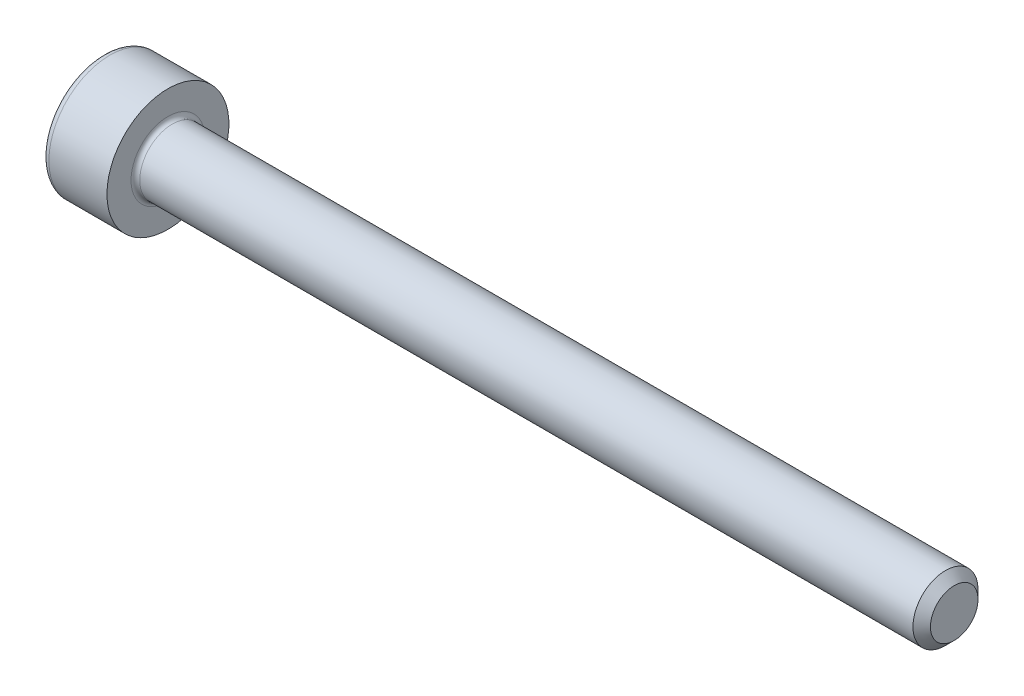
ISO-10303-21;
HEADER;
FILE_DESCRIPTION(('STEP AP214'),'2;1');
FILE_NAME('part.step','',(''),(''),'','','');
FILE_SCHEMA(('AUTOMOTIVE_DESIGN { 1 0 10303 214 1 1 1 1 }'));
ENDSEC;
DATA;
#1=APPLICATION_CONTEXT('core data for automotive mechanical design processes');
#2=APPLICATION_PROTOCOL_DEFINITION('international standard','automotive_design',2000,#1);
#3=PRODUCT_CONTEXT('',#1,'mechanical');
#4=PRODUCT('Part','Part','',(#3));
#5=PRODUCT_RELATED_PRODUCT_CATEGORY('part','',(#4));
#6=PRODUCT_DEFINITION_FORMATION('','',#4);
#7=PRODUCT_DEFINITION_CONTEXT('part definition',#1,'design');
#8=PRODUCT_DEFINITION('design','',#6,#7);
#9=PRODUCT_DEFINITION_SHAPE('','',#8);
#10=(LENGTH_UNIT() NAMED_UNIT(*) SI_UNIT(.MILLI.,.METRE.));
#11=(NAMED_UNIT(*) PLANE_ANGLE_UNIT() SI_UNIT($,.RADIAN.));
#12=(NAMED_UNIT(*) SI_UNIT($,.STERADIAN.) SOLID_ANGLE_UNIT());
#13=UNCERTAINTY_MEASURE_WITH_UNIT(LENGTH_MEASURE(1.E-05),#10,'distance_accuracy_value','');
#14=(GEOMETRIC_REPRESENTATION_CONTEXT(3) GLOBAL_UNCERTAINTY_ASSIGNED_CONTEXT((#13)) GLOBAL_UNIT_ASSIGNED_CONTEXT((#10,
#11,#12)) REPRESENTATION_CONTEXT('',''));
#15=CARTESIAN_POINT('',(0.,0.,0.));
#16=DIRECTION('',(0.,0.,1.));
#17=DIRECTION('',(1.,0.,0.));
#18=AXIS2_PLACEMENT_3D('',#15,#16,#17);
#19=CARTESIAN_POINT('',(0.,0.,0.));
#20=DIRECTION('',(-1.,0.,0.));
#21=DIRECTION('',(0.,0.,1.));
#22=AXIS2_PLACEMENT_3D('',#19,#20,#21);
#23=CYLINDRICAL_SURFACE('',#22,1.39568824458778);
#24=CARTESIAN_POINT('',(0.16,0.,0.));
#25=DIRECTION('',(1.,0.,0.));
#26=DIRECTION('',(0.,0.,-1.));
#27=AXIS2_PLACEMENT_3D('',#24,#25,#26);
#28=CIRCLE('',#27,1.39568824458778);
#29=CARTESIAN_POINT('',(0.16,0.,-1.39568824458778));
#30=VERTEX_POINT('',#29);
#31=EDGE_CURVE('E158',#30,#30,#28,.T.);
#32=ORIENTED_EDGE('',*,*,#31,.T.);
#33=EDGE_LOOP('',(#32));
#34=FACE_BOUND('',#33,.T.);
#35=CARTESIAN_POINT('',(1.48873412756029,0.,0.));
#36=DIRECTION('',(-1.,0.,0.));
#37=DIRECTION('',(0.,0.,1.));
#38=AXIS2_PLACEMENT_3D('',#35,#36,#37);
#39=CIRCLE('',#38,1.39568824458778);
#40=CARTESIAN_POINT('',(1.48873412756029,0.,1.39568824458778));
#41=VERTEX_POINT('',#40);
#42=EDGE_CURVE('E141',#41,#41,#39,.T.);
#43=ORIENTED_EDGE('',*,*,#42,.T.);
#44=EDGE_LOOP('',(#43));
#45=FACE_BOUND('',#44,.T.);
#46=ADVANCED_FACE('F39',(#34,#45),#23,.T.);
#47=CARTESIAN_POINT('',(0.,0.,0.));
#48=DIRECTION('',(1.,0.,0.));
#49=DIRECTION('',(0.,0.,-1.));
#50=AXIS2_PLACEMENT_3D('',#47,#48,#49);
#51=PLANE('',#50);
#52=DIRECTION('',(0.,-0.5,-0.866025403784439));
#53=VECTOR('',#52,1.);
#54=CARTESIAN_POINT('',(0.,0.877572409168232,0.));
#55=LINE('',#54,#53);
#56=CARTESIAN_POINT('',(0.,0.877572409168232,0.));
#57=VERTEX_POINT('',#56);
#58=CARTESIAN_POINT('',(0.,0.438786204584116,-0.760000000000001));
#59=VERTEX_POINT('',#58);
#60=EDGE_CURVE('E128',#57,#59,#55,.T.);
#61=ORIENTED_EDGE('',*,*,#60,.F.);
#62=DIRECTION('',(0.,0.5,-0.866025403784439));
#63=VECTOR('',#62,1.);
#64=CARTESIAN_POINT('',(0.,0.438786204584116,0.76));
#65=LINE('',#64,#63);
#66=CARTESIAN_POINT('',(0.,0.438786204584116,0.76));
#67=VERTEX_POINT('',#66);
#68=EDGE_CURVE('E54',#67,#57,#65,.T.);
#69=ORIENTED_EDGE('',*,*,#68,.F.);
#70=DIRECTION('',(0.,1.,0.));
#71=VECTOR('',#70,1.);
#72=CARTESIAN_POINT('',(0.,-0.438786204584116,0.76));
#73=LINE('',#72,#71);
#74=CARTESIAN_POINT('',(0.,-0.438786204584116,0.76));
#75=VERTEX_POINT('',#74);
#76=EDGE_CURVE('E137',#75,#67,#73,.T.);
#77=ORIENTED_EDGE('',*,*,#76,.F.);
#78=DIRECTION('',(0.,0.5,0.866025403784439));
#79=VECTOR('',#78,1.);
#80=CARTESIAN_POINT('',(0.,-0.877572409168232,0.));
#81=LINE('',#80,#79);
#82=CARTESIAN_POINT('',(0.,-0.877572409168232,0.));
#83=VERTEX_POINT('',#82);
#84=EDGE_CURVE('E135',#83,#75,#81,.T.);
#85=ORIENTED_EDGE('',*,*,#84,.F.);
#86=DIRECTION('',(0.,-0.5,0.866025403784438));
#87=VECTOR('',#86,1.);
#88=CARTESIAN_POINT('',(0.,-0.438786204584116,-0.760000000000001));
#89=LINE('',#88,#87);
#90=CARTESIAN_POINT('',(0.,-0.438786204584116,-0.760000000000001));
#91=VERTEX_POINT('',#90);
#92=EDGE_CURVE('E102',#91,#83,#89,.T.);
#93=ORIENTED_EDGE('',*,*,#92,.F.);
#94=DIRECTION('',(0.,-1.,0.));
#95=VECTOR('',#94,1.);
#96=CARTESIAN_POINT('',(0.,0.438786204584116,-0.760000000000001));
#97=LINE('',#96,#95);
#98=EDGE_CURVE('E131',#59,#91,#97,.T.);
#99=ORIENTED_EDGE('',*,*,#98,.F.);
#100=EDGE_LOOP('',(#61,#69,#77,#85,#93,#99));
#101=FACE_BOUND('',#100,.T.);
#102=CARTESIAN_POINT('',(0.,0.,0.));
#103=DIRECTION('',(1.,0.,0.));
#104=DIRECTION('',(0.,0.,-1.));
#105=AXIS2_PLACEMENT_3D('',#102,#103,#104);
#106=CIRCLE('',#105,1.23568824458778);
#107=CARTESIAN_POINT('',(0.,0.,-1.23568824458778));
#108=VERTEX_POINT('',#107);
#109=EDGE_CURVE('E155',#108,#108,#106,.F.);
#110=ORIENTED_EDGE('',*,*,#109,.T.);
#111=EDGE_LOOP('',(#110));
#112=FACE_BOUND('',#111,.T.);
#113=ADVANCED_FACE('F180',(#101,#112),#51,.F.);
#114=CARTESIAN_POINT('',(19.4887341275603,0.,0.));
#115=DIRECTION('',(-1.,0.,0.));
#116=DIRECTION('',(0.,0.,1.));
#117=AXIS2_PLACEMENT_3D('',#114,#115,#116);
#118=PLANE('',#117);
#119=CARTESIAN_POINT('',(19.4887341275603,0.,0.));
#120=DIRECTION('',(-1.,0.,0.));
#121=DIRECTION('',(0.,0.,1.));
#122=AXIS2_PLACEMENT_3D('',#119,#120,#121);
#123=CIRCLE('',#122,0.544367063780145);
#124=CARTESIAN_POINT('',(19.4887341275603,0.,0.544367063780145));
#125=VERTEX_POINT('',#124);
#126=EDGE_CURVE('E11',#125,#125,#123,.F.);
#127=ORIENTED_EDGE('',*,*,#126,.T.);
#128=EDGE_LOOP('',(#127));
#129=FACE_BOUND('',#128,.T.);
#130=ADVANCED_FACE('F186',(#129),#118,.F.);
#131=CARTESIAN_POINT('',(0.,0.,0.));
#132=DIRECTION('',(-1.,0.,0.));
#133=DIRECTION('',(0.,0.,1.));
#134=AXIS2_PLACEMENT_3D('',#131,#132,#133);
#135=CYLINDRICAL_SURFACE('',#134,0.744367063780148);
#136=CARTESIAN_POINT('',(19.2887341275603,0.,0.));
#137=DIRECTION('',(-1.,0.,0.));
#138=DIRECTION('',(0.,0.,1.));
#139=AXIS2_PLACEMENT_3D('',#136,#137,#138);
#140=CIRCLE('',#139,0.744367063780148);
#141=CARTESIAN_POINT('',(19.2887341275603,0.,0.744367063780148));
#142=VERTEX_POINT('',#141);
#143=EDGE_CURVE('E47',#142,#142,#140,.T.);
#144=ORIENTED_EDGE('',*,*,#143,.T.);
#145=EDGE_LOOP('',(#144));
#146=FACE_BOUND('',#145,.T.);
#147=CARTESIAN_POINT('',(1.58873412756029,0.,0.));
#148=DIRECTION('',(-1.,0.,0.));
#149=DIRECTION('',(0.,0.,1.));
#150=AXIS2_PLACEMENT_3D('',#147,#148,#149);
#151=CIRCLE('',#150,0.744367063780148);
#152=CARTESIAN_POINT('',(1.58873412756029,0.,0.744367063780148));
#153=VERTEX_POINT('',#152);
#154=EDGE_CURVE('E152',#153,#153,#151,.F.);
#155=ORIENTED_EDGE('',*,*,#154,.T.);
#156=EDGE_LOOP('',(#155));
#157=FACE_BOUND('',#156,.T.);
#158=ADVANCED_FACE('F163',(#146,#157),#135,.T.);
#159=CARTESIAN_POINT('',(1.48873412756029,0.,0.));
#160=DIRECTION('',(-1.,0.,0.));
#161=DIRECTION('',(0.,0.,1.));
#162=AXIS2_PLACEMENT_3D('',#159,#160,#161);
#163=PLANE('',#162);
#164=CARTESIAN_POINT('',(1.48873412756029,0.,0.));
#165=DIRECTION('',(-1.,0.,0.));
#166=DIRECTION('',(0.,0.,1.));
#167=AXIS2_PLACEMENT_3D('',#164,#165,#166);
#168=CIRCLE('',#167,0.844367063780148);
#169=CARTESIAN_POINT('',(1.48873412756029,0.,0.844367063780148));
#170=VERTEX_POINT('',#169);
#171=EDGE_CURVE('E149',#170,#170,#168,.T.);
#172=ORIENTED_EDGE('',*,*,#171,.T.);
#173=EDGE_LOOP('',(#172));
#174=FACE_BOUND('',#173,.T.);
#175=ORIENTED_EDGE('',*,*,#42,.F.);
#176=EDGE_LOOP('',(#175));
#177=FACE_BOUND('',#176,.T.);
#178=ADVANCED_FACE('F193',(#174,#177),#163,.F.);
#179=CARTESIAN_POINT('',(1.58873412756029,0.,0.));
#180=DIRECTION('',(-1.,0.,0.));
#181=DIRECTION('',(0.,0.,1.));
#182=AXIS2_PLACEMENT_3D('',#179,#180,#181);
#183=TOROIDAL_SURFACE('',#182,0.844367063780148,0.1);
#184=ORIENTED_EDGE('',*,*,#154,.F.);
#185=EDGE_LOOP('',(#184));
#186=FACE_BOUND('',#185,.T.);
#187=ORIENTED_EDGE('',*,*,#171,.F.);
#188=EDGE_LOOP('',(#187));
#189=FACE_BOUND('',#188,.T.);
#190=ADVANCED_FACE('F176',(#186,#189),#183,.F.);
#191=CARTESIAN_POINT('',(0.16,0.,0.));
#192=DIRECTION('',(1.,0.,0.));
#193=DIRECTION('',(0.,0.,-1.));
#194=AXIS2_PLACEMENT_3D('',#191,#192,#193);
#195=TOROIDAL_SURFACE('',#194,1.23568824458778,0.16);
#196=ORIENTED_EDGE('',*,*,#31,.F.);
#197=EDGE_LOOP('',(#196));
#198=FACE_BOUND('',#197,.T.);
#199=ORIENTED_EDGE('',*,*,#109,.F.);
#200=EDGE_LOOP('',(#199));
#201=FACE_BOUND('',#200,.T.);
#202=ADVANCED_FACE('F168',(#198,#201),#195,.T.);
#203=CARTESIAN_POINT('',(19.2887341275603,0.,0.));
#204=DIRECTION('',(-1.,0.,0.));
#205=DIRECTION('',(0.,0.,1.));
#206=AXIS2_PLACEMENT_3D('',#203,#204,#205);
#207=CONICAL_SURFACE('',#206,0.744367063780148,0.78539816339745);
#208=ORIENTED_EDGE('',*,*,#126,.F.);
#209=EDGE_LOOP('',(#208));
#210=FACE_BOUND('',#209,.T.);
#211=ORIENTED_EDGE('',*,*,#143,.F.);
#212=EDGE_LOOP('',(#211));
#213=FACE_BOUND('',#212,.T.);
#214=ADVANCED_FACE('F41',(#210,#213),#207,.T.);
#215=CARTESIAN_POINT('',(0.7,0.438786204584116,0.76));
#216=DIRECTION('',(0.,0.866025403784439,0.5));
#217=DIRECTION('',(0.,-0.5,0.866025403784439));
#218=AXIS2_PLACEMENT_3D('',#215,#216,#217);
#219=PLANE('',#218);
#220=ORIENTED_EDGE('',*,*,#68,.T.);
#221=DIRECTION('',(-1.,0.,0.));
#222=VECTOR('',#221,1.);
#223=CARTESIAN_POINT('',(0.7,0.877572409168232,0.));
#224=LINE('',#223,#222);
#225=CARTESIAN_POINT('',(0.7,0.877572409168232,0.));
#226=VERTEX_POINT('',#225);
#227=EDGE_CURVE('E84',#226,#57,#224,.T.);
#228=ORIENTED_EDGE('',*,*,#227,.F.);
#229=DIRECTION('',(0.,0.5,-0.866025403784439));
#230=VECTOR('',#229,1.);
#231=CARTESIAN_POINT('',(0.7,0.438786204584116,0.76));
#232=LINE('',#231,#230);
#233=CARTESIAN_POINT('',(0.7,0.438786204584116,0.76));
#234=VERTEX_POINT('',#233);
#235=EDGE_CURVE('E139',#234,#226,#232,.T.);
#236=ORIENTED_EDGE('',*,*,#235,.F.);
#237=DIRECTION('',(-1.,0.,0.));
#238=VECTOR('',#237,1.);
#239=CARTESIAN_POINT('',(0.7,0.438786204584116,0.76));
#240=LINE('',#239,#238);
#241=EDGE_CURVE('E62',#234,#67,#240,.T.);
#242=ORIENTED_EDGE('',*,*,#241,.T.);
#243=EDGE_LOOP('',(#220,#228,#236,#242));
#244=FACE_BOUND('',#243,.T.);
#245=ADVANCED_FACE('F167',(#244),#219,.F.);
#246=CARTESIAN_POINT('',(0.7,-0.438786204584116,0.76));
#247=DIRECTION('',(0.,0.,1.));
#248=DIRECTION('',(1.,0.,0.));
#249=AXIS2_PLACEMENT_3D('',#246,#247,#248);
#250=PLANE('',#249);
#251=ORIENTED_EDGE('',*,*,#76,.T.);
#252=ORIENTED_EDGE('',*,*,#241,.F.);
#253=DIRECTION('',(0.,1.,0.));
#254=VECTOR('',#253,1.);
#255=CARTESIAN_POINT('',(0.7,-0.438786204584116,0.76));
#256=LINE('',#255,#254);
#257=CARTESIAN_POINT('',(0.7,-0.438786204584116,0.76));
#258=VERTEX_POINT('',#257);
#259=EDGE_CURVE('E114',#258,#234,#256,.T.);
#260=ORIENTED_EDGE('',*,*,#259,.F.);
#261=DIRECTION('',(-1.,0.,0.));
#262=VECTOR('',#261,1.);
#263=CARTESIAN_POINT('',(0.7,-0.438786204584116,0.76));
#264=LINE('',#263,#262);
#265=EDGE_CURVE('E106',#258,#75,#264,.T.);
#266=ORIENTED_EDGE('',*,*,#265,.T.);
#267=EDGE_LOOP('',(#251,#252,#260,#266));
#268=FACE_BOUND('',#267,.T.);
#269=ADVANCED_FACE('F174',(#268),#250,.F.);
#270=CARTESIAN_POINT('',(0.7,-0.877572409168232,0.));
#271=DIRECTION('',(0.,-0.866025403784439,0.5));
#272=DIRECTION('',(0.,-0.5,-0.866025403784439));
#273=AXIS2_PLACEMENT_3D('',#270,#271,#272);
#274=PLANE('',#273);
#275=ORIENTED_EDGE('',*,*,#84,.T.);
#276=ORIENTED_EDGE('',*,*,#265,.F.);
#277=DIRECTION('',(0.,0.5,0.866025403784439));
#278=VECTOR('',#277,1.);
#279=CARTESIAN_POINT('',(0.7,-0.877572409168232,0.));
#280=LINE('',#279,#278);
#281=CARTESIAN_POINT('',(0.7,-0.877572409168232,0.));
#282=VERTEX_POINT('',#281);
#283=EDGE_CURVE('E110',#282,#258,#280,.T.);
#284=ORIENTED_EDGE('',*,*,#283,.F.);
#285=DIRECTION('',(-1.,0.,0.));
#286=VECTOR('',#285,1.);
#287=CARTESIAN_POINT('',(0.7,-0.877572409168232,0.));
#288=LINE('',#287,#286);
#289=EDGE_CURVE('E95',#282,#83,#288,.T.);
#290=ORIENTED_EDGE('',*,*,#289,.T.);
#291=EDGE_LOOP('',(#275,#276,#284,#290));
#292=FACE_BOUND('',#291,.T.);
#293=ADVANCED_FACE('F111',(#292),#274,.F.);
#294=CARTESIAN_POINT('',(0.7,-0.438786204584116,-0.760000000000001));
#295=DIRECTION('',(0.,-0.866025403784438,-0.5));
#296=DIRECTION('',(0.,0.5,-0.866025403784438));
#297=AXIS2_PLACEMENT_3D('',#294,#295,#296);
#298=PLANE('',#297);
#299=ORIENTED_EDGE('',*,*,#92,.T.);
#300=ORIENTED_EDGE('',*,*,#289,.F.);
#301=DIRECTION('',(0.,-0.5,0.866025403784438));
#302=VECTOR('',#301,1.);
#303=CARTESIAN_POINT('',(0.7,-0.438786204584116,-0.760000000000001));
#304=LINE('',#303,#302);
#305=CARTESIAN_POINT('',(0.7,-0.438786204584116,-0.760000000000001));
#306=VERTEX_POINT('',#305);
#307=EDGE_CURVE('E99',#306,#282,#304,.T.);
#308=ORIENTED_EDGE('',*,*,#307,.F.);
#309=DIRECTION('',(-1.,0.,0.));
#310=VECTOR('',#309,1.);
#311=CARTESIAN_POINT('',(0.7,-0.438786204584116,-0.760000000000001));
#312=LINE('',#311,#310);
#313=EDGE_CURVE('E107',#306,#91,#312,.T.);
#314=ORIENTED_EDGE('',*,*,#313,.T.);
#315=EDGE_LOOP('',(#299,#300,#308,#314));
#316=FACE_BOUND('',#315,.T.);
#317=ADVANCED_FACE('F97',(#316),#298,.F.);
#318=CARTESIAN_POINT('',(0.7,0.438786204584116,-0.760000000000001));
#319=DIRECTION('',(0.,0.,-1.));
#320=DIRECTION('',(0.,1.,0.));
#321=AXIS2_PLACEMENT_3D('',#318,#319,#320);
#322=PLANE('',#321);
#323=ORIENTED_EDGE('',*,*,#98,.T.);
#324=ORIENTED_EDGE('',*,*,#313,.F.);
#325=DIRECTION('',(0.,-1.,0.));
#326=VECTOR('',#325,1.);
#327=CARTESIAN_POINT('',(0.7,0.438786204584116,-0.760000000000001));
#328=LINE('',#327,#326);
#329=CARTESIAN_POINT('',(0.7,0.438786204584116,-0.760000000000001));
#330=VERTEX_POINT('',#329);
#331=EDGE_CURVE('E120',#330,#306,#328,.T.);
#332=ORIENTED_EDGE('',*,*,#331,.F.);
#333=DIRECTION('',(-1.,0.,0.));
#334=VECTOR('',#333,1.);
#335=CARTESIAN_POINT('',(0.7,0.438786204584116,-0.760000000000001));
#336=LINE('',#335,#334);
#337=EDGE_CURVE('E144',#330,#59,#336,.T.);
#338=ORIENTED_EDGE('',*,*,#337,.T.);
#339=EDGE_LOOP('',(#323,#324,#332,#338));
#340=FACE_BOUND('',#339,.T.);
#341=ADVANCED_FACE('F215',(#340),#322,.F.);
#342=CARTESIAN_POINT('',(0.7,0.877572409168232,0.));
#343=DIRECTION('',(0.,0.866025403784439,-0.5));
#344=DIRECTION('',(0.,0.5,0.866025403784439));
#345=AXIS2_PLACEMENT_3D('',#342,#343,#344);
#346=PLANE('',#345);
#347=ORIENTED_EDGE('',*,*,#60,.T.);
#348=ORIENTED_EDGE('',*,*,#337,.F.);
#349=DIRECTION('',(0.,-0.5,-0.866025403784439));
#350=VECTOR('',#349,1.);
#351=CARTESIAN_POINT('',(0.7,0.877572409168232,0.));
#352=LINE('',#351,#350);
#353=EDGE_CURVE('E122',#226,#330,#352,.T.);
#354=ORIENTED_EDGE('',*,*,#353,.F.);
#355=ORIENTED_EDGE('',*,*,#227,.T.);
#356=EDGE_LOOP('',(#347,#348,#354,#355));
#357=FACE_BOUND('',#356,.T.);
#358=ADVANCED_FACE('F212',(#357),#346,.F.);
#359=CARTESIAN_POINT('',(0.7,0.,0.));
#360=DIRECTION('',(-1.,0.,0.));
#361=DIRECTION('',(0.,0.,1.));
#362=AXIS2_PLACEMENT_3D('',#359,#360,#361);
#363=PLANE('',#362);
#364=ORIENTED_EDGE('',*,*,#235,.T.);
#365=ORIENTED_EDGE('',*,*,#353,.T.);
#366=ORIENTED_EDGE('',*,*,#331,.T.);
#367=ORIENTED_EDGE('',*,*,#307,.T.);
#368=ORIENTED_EDGE('',*,*,#283,.T.);
#369=ORIENTED_EDGE('',*,*,#259,.T.);
#370=EDGE_LOOP('',(#364,#365,#366,#367,#368,#369));
#371=FACE_BOUND('',#370,.T.);
#372=ADVANCED_FACE('F117',(#371),#363,.T.);
#373=CLOSED_SHELL('',(#46,#113,#130,#158,#178,#190,#202,#214,#245,#269,#293,#317,#341,#358,#372));
#374=MANIFOLD_SOLID_BREP('B2',#373);
#375=ADVANCED_BREP_SHAPE_REPRESENTATION('',(#18,#374),#14);
#376=SHAPE_DEFINITION_REPRESENTATION(#9,#375);
ENDSEC;
END-ISO-10303-21;
